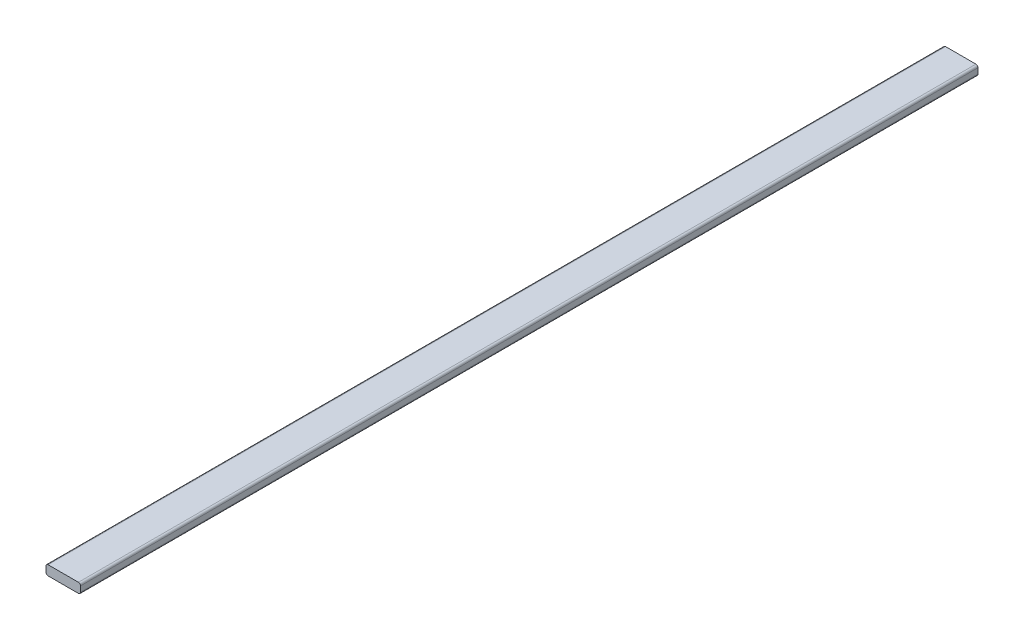
ISO-10303-21;
HEADER;
FILE_DESCRIPTION(('STEP AP214'),'2;1');
FILE_NAME('part.step','',(''),(''),'','','');
FILE_SCHEMA(('AUTOMOTIVE_DESIGN { 1 0 10303 214 1 1 1 1 }'));
ENDSEC;
DATA;
#1=APPLICATION_CONTEXT('core data for automotive mechanical design processes');
#2=APPLICATION_PROTOCOL_DEFINITION('international standard','automotive_design',2000,#1);
#3=PRODUCT_CONTEXT('',#1,'mechanical');
#4=PRODUCT('Part','Part','',(#3));
#5=PRODUCT_RELATED_PRODUCT_CATEGORY('part','',(#4));
#6=PRODUCT_DEFINITION_FORMATION('','',#4);
#7=PRODUCT_DEFINITION_CONTEXT('part definition',#1,'design');
#8=PRODUCT_DEFINITION('design','',#6,#7);
#9=PRODUCT_DEFINITION_SHAPE('','',#8);
#10=(LENGTH_UNIT() NAMED_UNIT(*) SI_UNIT(.MILLI.,.METRE.));
#11=(NAMED_UNIT(*) PLANE_ANGLE_UNIT() SI_UNIT($,.RADIAN.));
#12=(NAMED_UNIT(*) SI_UNIT($,.STERADIAN.) SOLID_ANGLE_UNIT());
#13=UNCERTAINTY_MEASURE_WITH_UNIT(LENGTH_MEASURE(1.E-05),#10,'distance_accuracy_value','');
#14=(GEOMETRIC_REPRESENTATION_CONTEXT(3) GLOBAL_UNCERTAINTY_ASSIGNED_CONTEXT((#13)) GLOBAL_UNIT_ASSIGNED_CONTEXT((#10,
#11,#12)) REPRESENTATION_CONTEXT('',''));
#15=CARTESIAN_POINT('',(0.,0.,0.));
#16=DIRECTION('',(0.,0.,1.));
#17=DIRECTION('',(1.,0.,0.));
#18=AXIS2_PLACEMENT_3D('',#15,#16,#17);
#19=CARTESIAN_POINT('',(0.,3.556,330.2));
#20=DIRECTION('',(1.,0.,0.));
#21=DIRECTION('',(0.,0.,-1.));
#22=AXIS2_PLACEMENT_3D('',#19,#20,#21);
#23=PLANE('',#22);
#24=DIRECTION('',(0.,-1.,0.));
#25=VECTOR('',#24,1.);
#26=CARTESIAN_POINT('',(0.,3.556,0.));
#27=LINE('',#26,#25);
#28=CARTESIAN_POINT('',(0.,2.794,0.));
#29=VERTEX_POINT('',#28);
#30=CARTESIAN_POINT('',(0.,0.762,0.));
#31=VERTEX_POINT('',#30);
#32=EDGE_CURVE('E156',#29,#31,#27,.T.);
#33=ORIENTED_EDGE('',*,*,#32,.T.);
#34=DIRECTION('',(0.,0.,-1.));
#35=VECTOR('',#34,1.);
#36=CARTESIAN_POINT('',(0.,0.762,330.2));
#37=LINE('',#36,#35);
#38=CARTESIAN_POINT('',(0.,0.762,330.2));
#39=VERTEX_POINT('',#38);
#40=EDGE_CURVE('E11',#31,#39,#37,.F.);
#41=ORIENTED_EDGE('',*,*,#40,.T.);
#42=DIRECTION('',(0.,-1.,0.));
#43=VECTOR('',#42,1.);
#44=CARTESIAN_POINT('',(0.,3.556,330.2));
#45=LINE('',#44,#43);
#46=CARTESIAN_POINT('',(0.,2.794,330.2));
#47=VERTEX_POINT('',#46);
#48=EDGE_CURVE('E124',#47,#39,#45,.T.);
#49=ORIENTED_EDGE('',*,*,#48,.F.);
#50=DIRECTION('',(0.,0.,-1.));
#51=VECTOR('',#50,1.);
#52=CARTESIAN_POINT('',(0.,2.794,330.2));
#53=LINE('',#52,#51);
#54=EDGE_CURVE('E40',#47,#29,#53,.T.);
#55=ORIENTED_EDGE('',*,*,#54,.T.);
#56=EDGE_LOOP('',(#33,#41,#49,#55));
#57=FACE_BOUND('',#56,.T.);
#58=ADVANCED_FACE('F32',(#57),#23,.F.);
#59=CARTESIAN_POINT('',(0.,0.,330.2));
#60=DIRECTION('',(0.,1.,0.));
#61=DIRECTION('',(0.,0.,1.));
#62=AXIS2_PLACEMENT_3D('',#59,#60,#61);
#63=PLANE('',#62);
#64=DIRECTION('',(1.,0.,0.));
#65=VECTOR('',#64,1.);
#66=CARTESIAN_POINT('',(0.,0.,0.));
#67=LINE('',#66,#65);
#68=CARTESIAN_POINT('',(0.762,0.,0.));
#69=VERTEX_POINT('',#68);
#70=CARTESIAN_POINT('',(11.938,0.,0.));
#71=VERTEX_POINT('',#70);
#72=EDGE_CURVE('E129',#69,#71,#67,.T.);
#73=ORIENTED_EDGE('',*,*,#72,.T.);
#74=DIRECTION('',(0.,0.,-1.));
#75=VECTOR('',#74,1.);
#76=CARTESIAN_POINT('',(11.938,0.,330.2));
#77=LINE('',#76,#75);
#78=CARTESIAN_POINT('',(11.938,0.,330.2));
#79=VERTEX_POINT('',#78);
#80=EDGE_CURVE('E47',#71,#79,#77,.F.);
#81=ORIENTED_EDGE('',*,*,#80,.T.);
#82=DIRECTION('',(1.,0.,0.));
#83=VECTOR('',#82,1.);
#84=CARTESIAN_POINT('',(0.,0.,330.2));
#85=LINE('',#84,#83);
#86=CARTESIAN_POINT('',(0.762,0.,330.2));
#87=VERTEX_POINT('',#86);
#88=EDGE_CURVE('E127',#87,#79,#85,.T.);
#89=ORIENTED_EDGE('',*,*,#88,.F.);
#90=DIRECTION('',(0.,0.,-1.));
#91=VECTOR('',#90,1.);
#92=CARTESIAN_POINT('',(0.762,0.,330.2));
#93=LINE('',#92,#91);
#94=EDGE_CURVE('E148',#87,#69,#93,.T.);
#95=ORIENTED_EDGE('',*,*,#94,.T.);
#96=EDGE_LOOP('',(#73,#81,#89,#95));
#97=FACE_BOUND('',#96,.T.);
#98=ADVANCED_FACE('F176',(#97),#63,.F.);
#99=CARTESIAN_POINT('',(12.7,0.,330.2));
#100=DIRECTION('',(-1.,0.,0.));
#101=DIRECTION('',(0.,0.,1.));
#102=AXIS2_PLACEMENT_3D('',#99,#100,#101);
#103=PLANE('',#102);
#104=DIRECTION('',(0.,1.,0.));
#105=VECTOR('',#104,1.);
#106=CARTESIAN_POINT('',(12.7,0.,0.));
#107=LINE('',#106,#105);
#108=CARTESIAN_POINT('',(12.7,0.762,0.));
#109=VERTEX_POINT('',#108);
#110=CARTESIAN_POINT('',(12.7,2.794,0.));
#111=VERTEX_POINT('',#110);
#112=EDGE_CURVE('E125',#109,#111,#107,.T.);
#113=ORIENTED_EDGE('',*,*,#112,.T.);
#114=DIRECTION('',(0.,0.,-1.));
#115=VECTOR('',#114,1.);
#116=CARTESIAN_POINT('',(12.7,2.794,330.2));
#117=LINE('',#116,#115);
#118=CARTESIAN_POINT('',(12.7,2.794,330.2));
#119=VERTEX_POINT('',#118);
#120=EDGE_CURVE('E103',#111,#119,#117,.F.);
#121=ORIENTED_EDGE('',*,*,#120,.T.);
#122=DIRECTION('',(0.,1.,0.));
#123=VECTOR('',#122,1.);
#124=CARTESIAN_POINT('',(12.7,0.,330.2));
#125=LINE('',#124,#123);
#126=CARTESIAN_POINT('',(12.7,0.762,330.2));
#127=VERTEX_POINT('',#126);
#128=EDGE_CURVE('E164',#127,#119,#125,.T.);
#129=ORIENTED_EDGE('',*,*,#128,.F.);
#130=DIRECTION('',(0.,0.,-1.));
#131=VECTOR('',#130,1.);
#132=CARTESIAN_POINT('',(12.7,0.762,330.2));
#133=LINE('',#132,#131);
#134=EDGE_CURVE('E108',#127,#109,#133,.T.);
#135=ORIENTED_EDGE('',*,*,#134,.T.);
#136=EDGE_LOOP('',(#113,#121,#129,#135));
#137=FACE_BOUND('',#136,.T.);
#138=ADVANCED_FACE('F175',(#137),#103,.F.);
#139=CARTESIAN_POINT('',(12.7,3.556,330.2));
#140=DIRECTION('',(0.,-1.,0.));
#141=DIRECTION('',(0.,0.,-1.));
#142=AXIS2_PLACEMENT_3D('',#139,#140,#141);
#143=PLANE('',#142);
#144=DIRECTION('',(-1.,0.,0.));
#145=VECTOR('',#144,1.);
#146=CARTESIAN_POINT('',(12.7,3.556,330.2));
#147=LINE('',#146,#145);
#148=CARTESIAN_POINT('',(11.938,3.556,330.2));
#149=VERTEX_POINT('',#148);
#150=CARTESIAN_POINT('',(0.762000000000001,3.556,330.2));
#151=VERTEX_POINT('',#150);
#152=EDGE_CURVE('E118',#149,#151,#147,.T.);
#153=ORIENTED_EDGE('',*,*,#152,.F.);
#154=DIRECTION('',(0.,0.,-1.));
#155=VECTOR('',#154,1.);
#156=CARTESIAN_POINT('',(11.938,3.556,330.2));
#157=LINE('',#156,#155);
#158=CARTESIAN_POINT('',(11.938,3.556,0.));
#159=VERTEX_POINT('',#158);
#160=EDGE_CURVE('E102',#149,#159,#157,.T.);
#161=ORIENTED_EDGE('',*,*,#160,.T.);
#162=DIRECTION('',(-1.,0.,0.));
#163=VECTOR('',#162,1.);
#164=CARTESIAN_POINT('',(12.7,3.556,0.));
#165=LINE('',#164,#163);
#166=CARTESIAN_POINT('',(0.762000000000001,3.556,0.));
#167=VERTEX_POINT('',#166);
#168=EDGE_CURVE('E115',#159,#167,#165,.T.);
#169=ORIENTED_EDGE('',*,*,#168,.T.);
#170=DIRECTION('',(0.,0.,-1.));
#171=VECTOR('',#170,1.);
#172=CARTESIAN_POINT('',(0.762000000000001,3.556,330.2));
#173=LINE('',#172,#171);
#174=EDGE_CURVE('E120',#167,#151,#173,.F.);
#175=ORIENTED_EDGE('',*,*,#174,.T.);
#176=EDGE_LOOP('',(#153,#161,#169,#175));
#177=FACE_BOUND('',#176,.T.);
#178=ADVANCED_FACE('F114',(#177),#143,.F.);
#179=CARTESIAN_POINT('',(0.,0.,330.2));
#180=DIRECTION('',(0.,0.,1.));
#181=DIRECTION('',(1.,0.,0.));
#182=AXIS2_PLACEMENT_3D('',#179,#180,#181);
#183=PLANE('',#182);
#184=ORIENTED_EDGE('',*,*,#128,.T.);
#185=CARTESIAN_POINT('',(11.938,2.794,330.2));
#186=DIRECTION('',(0.,0.,1.));
#187=DIRECTION('',(1.,0.,0.));
#188=AXIS2_PLACEMENT_3D('',#185,#186,#187);
#189=CIRCLE('',#188,0.762);
#190=EDGE_CURVE('E146',#119,#149,#189,.T.);
#191=ORIENTED_EDGE('',*,*,#190,.T.);
#192=ORIENTED_EDGE('',*,*,#152,.T.);
#193=CARTESIAN_POINT('',(0.762,2.794,330.2));
#194=DIRECTION('',(0.,0.,1.));
#195=DIRECTION('',(1.,0.,0.));
#196=AXIS2_PLACEMENT_3D('',#193,#194,#195);
#197=CIRCLE('',#196,0.762);
#198=EDGE_CURVE('E141',#151,#47,#197,.T.);
#199=ORIENTED_EDGE('',*,*,#198,.T.);
#200=ORIENTED_EDGE('',*,*,#48,.T.);
#201=CARTESIAN_POINT('',(0.762,0.762,330.2));
#202=DIRECTION('',(0.,0.,1.));
#203=DIRECTION('',(1.,0.,0.));
#204=AXIS2_PLACEMENT_3D('',#201,#202,#203);
#205=CIRCLE('',#204,0.762);
#206=EDGE_CURVE('E54',#39,#87,#205,.T.);
#207=ORIENTED_EDGE('',*,*,#206,.T.);
#208=ORIENTED_EDGE('',*,*,#88,.T.);
#209=CARTESIAN_POINT('',(11.938,0.762,330.2));
#210=DIRECTION('',(0.,0.,1.));
#211=DIRECTION('',(1.,0.,0.));
#212=AXIS2_PLACEMENT_3D('',#209,#210,#211);
#213=CIRCLE('',#212,0.762);
#214=EDGE_CURVE('E144',#79,#127,#213,.T.);
#215=ORIENTED_EDGE('',*,*,#214,.T.);
#216=EDGE_LOOP('',(#184,#191,#192,#199,#200,#207,#208,#215));
#217=FACE_BOUND('',#216,.T.);
#218=ADVANCED_FACE('F168',(#217),#183,.T.);
#219=CARTESIAN_POINT('',(0.,0.,0.));
#220=DIRECTION('',(0.,0.,1.));
#221=DIRECTION('',(1.,0.,0.));
#222=AXIS2_PLACEMENT_3D('',#219,#220,#221);
#223=PLANE('',#222);
#224=ORIENTED_EDGE('',*,*,#168,.F.);
#225=CARTESIAN_POINT('',(11.938,2.794,0.));
#226=DIRECTION('',(0.,0.,1.));
#227=DIRECTION('',(1.,0.,0.));
#228=AXIS2_PLACEMENT_3D('',#225,#226,#227);
#229=CIRCLE('',#228,0.762);
#230=EDGE_CURVE('E98',#159,#111,#229,.F.);
#231=ORIENTED_EDGE('',*,*,#230,.T.);
#232=ORIENTED_EDGE('',*,*,#112,.F.);
#233=CARTESIAN_POINT('',(11.938,0.762,0.));
#234=DIRECTION('',(0.,0.,1.));
#235=DIRECTION('',(1.,0.,0.));
#236=AXIS2_PLACEMENT_3D('',#233,#234,#235);
#237=CIRCLE('',#236,0.762);
#238=EDGE_CURVE('E109',#109,#71,#237,.F.);
#239=ORIENTED_EDGE('',*,*,#238,.T.);
#240=ORIENTED_EDGE('',*,*,#72,.F.);
#241=CARTESIAN_POINT('',(0.762,0.762,0.));
#242=DIRECTION('',(0.,0.,1.));
#243=DIRECTION('',(1.,0.,0.));
#244=AXIS2_PLACEMENT_3D('',#241,#242,#243);
#245=CIRCLE('',#244,0.762);
#246=EDGE_CURVE('E135',#69,#31,#245,.F.);
#247=ORIENTED_EDGE('',*,*,#246,.T.);
#248=ORIENTED_EDGE('',*,*,#32,.F.);
#249=CARTESIAN_POINT('',(0.762,2.794,0.));
#250=DIRECTION('',(0.,0.,1.));
#251=DIRECTION('',(1.,0.,0.));
#252=AXIS2_PLACEMENT_3D('',#249,#250,#251);
#253=CIRCLE('',#252,0.762);
#254=EDGE_CURVE('E119',#29,#167,#253,.F.);
#255=ORIENTED_EDGE('',*,*,#254,.T.);
#256=EDGE_LOOP('',(#224,#231,#232,#239,#240,#247,#248,#255));
#257=FACE_BOUND('',#256,.T.);
#258=ADVANCED_FACE('F122',(#257),#223,.F.);
#259=CARTESIAN_POINT('',(11.938,2.794,330.2));
#260=DIRECTION('',(0.,0.,-1.));
#261=DIRECTION('',(-1.,0.,0.));
#262=AXIS2_PLACEMENT_3D('',#259,#260,#261);
#263=CYLINDRICAL_SURFACE('',#262,0.762);
#264=ORIENTED_EDGE('',*,*,#190,.F.);
#265=ORIENTED_EDGE('',*,*,#120,.F.);
#266=ORIENTED_EDGE('',*,*,#230,.F.);
#267=ORIENTED_EDGE('',*,*,#160,.F.);
#268=EDGE_LOOP('',(#264,#265,#266,#267));
#269=FACE_BOUND('',#268,.T.);
#270=ADVANCED_FACE('F101',(#269),#263,.T.);
#271=CARTESIAN_POINT('',(11.938,0.762,330.2));
#272=DIRECTION('',(0.,0.,-1.));
#273=DIRECTION('',(-1.,0.,0.));
#274=AXIS2_PLACEMENT_3D('',#271,#272,#273);
#275=CYLINDRICAL_SURFACE('',#274,0.762);
#276=ORIENTED_EDGE('',*,*,#214,.F.);
#277=ORIENTED_EDGE('',*,*,#80,.F.);
#278=ORIENTED_EDGE('',*,*,#238,.F.);
#279=ORIENTED_EDGE('',*,*,#134,.F.);
#280=EDGE_LOOP('',(#276,#277,#278,#279));
#281=FACE_BOUND('',#280,.T.);
#282=ADVANCED_FACE('F173',(#281),#275,.T.);
#283=CARTESIAN_POINT('',(0.762,0.762,330.2));
#284=DIRECTION('',(0.,0.,-1.));
#285=DIRECTION('',(-1.,0.,0.));
#286=AXIS2_PLACEMENT_3D('',#283,#284,#285);
#287=CYLINDRICAL_SURFACE('',#286,0.762);
#288=ORIENTED_EDGE('',*,*,#206,.F.);
#289=ORIENTED_EDGE('',*,*,#40,.F.);
#290=ORIENTED_EDGE('',*,*,#246,.F.);
#291=ORIENTED_EDGE('',*,*,#94,.F.);
#292=EDGE_LOOP('',(#288,#289,#290,#291));
#293=FACE_BOUND('',#292,.T.);
#294=ADVANCED_FACE('F178',(#293),#287,.T.);
#295=CARTESIAN_POINT('',(0.762,2.794,330.2));
#296=DIRECTION('',(0.,0.,-1.));
#297=DIRECTION('',(-1.,0.,0.));
#298=AXIS2_PLACEMENT_3D('',#295,#296,#297);
#299=CYLINDRICAL_SURFACE('',#298,0.762);
#300=ORIENTED_EDGE('',*,*,#198,.F.);
#301=ORIENTED_EDGE('',*,*,#174,.F.);
#302=ORIENTED_EDGE('',*,*,#254,.F.);
#303=ORIENTED_EDGE('',*,*,#54,.F.);
#304=EDGE_LOOP('',(#300,#301,#302,#303));
#305=FACE_BOUND('',#304,.T.);
#306=ADVANCED_FACE('F34',(#305),#299,.T.);
#307=CLOSED_SHELL('',(#58,#98,#138,#178,#218,#258,#270,#282,#294,#306));
#308=MANIFOLD_SOLID_BREP('B2',#307);
#309=ADVANCED_BREP_SHAPE_REPRESENTATION('',(#18,#308),#14);
#310=SHAPE_DEFINITION_REPRESENTATION(#9,#309);
ENDSEC;
END-ISO-10303-21;
